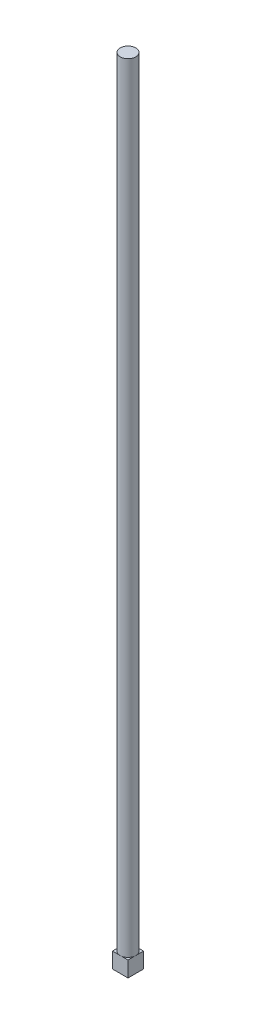
ISO-10303-21;
HEADER;
FILE_DESCRIPTION(('STEP AP214'),'2;1');
FILE_NAME('part.step','',(''),(''),'','','');
FILE_SCHEMA(('AUTOMOTIVE_DESIGN { 1 0 10303 214 1 1 1 1 }'));
ENDSEC;
DATA;
#1=APPLICATION_CONTEXT('core data for automotive mechanical design processes');
#2=APPLICATION_PROTOCOL_DEFINITION('international standard','automotive_design',2000,#1);
#3=PRODUCT_CONTEXT('',#1,'mechanical');
#4=PRODUCT('Part','Part','',(#3));
#5=PRODUCT_RELATED_PRODUCT_CATEGORY('part','',(#4));
#6=PRODUCT_DEFINITION_FORMATION('','',#4);
#7=PRODUCT_DEFINITION_CONTEXT('part definition',#1,'design');
#8=PRODUCT_DEFINITION('design','',#6,#7);
#9=PRODUCT_DEFINITION_SHAPE('','',#8);
#10=(LENGTH_UNIT() NAMED_UNIT(*) SI_UNIT(.MILLI.,.METRE.));
#11=(NAMED_UNIT(*) PLANE_ANGLE_UNIT() SI_UNIT($,.RADIAN.));
#12=(NAMED_UNIT(*) SI_UNIT($,.STERADIAN.) SOLID_ANGLE_UNIT());
#13=UNCERTAINTY_MEASURE_WITH_UNIT(LENGTH_MEASURE(1.E-05),#10,'distance_accuracy_value','');
#14=(GEOMETRIC_REPRESENTATION_CONTEXT(3) GLOBAL_UNCERTAINTY_ASSIGNED_CONTEXT((#13)) GLOBAL_UNIT_ASSIGNED_CONTEXT((#10,
#11,#12)) REPRESENTATION_CONTEXT('',''));
#15=CARTESIAN_POINT('',(0.,0.,0.));
#16=DIRECTION('',(0.,0.,1.));
#17=DIRECTION('',(1.,0.,0.));
#18=AXIS2_PLACEMENT_3D('',#15,#16,#17);
#19=CARTESIAN_POINT('',(0.,0.,0.));
#20=DIRECTION('',(0.,1.,0.));
#21=DIRECTION('',(0.,0.,1.));
#22=AXIS2_PLACEMENT_3D('',#19,#20,#21);
#23=PLANE('',#22);
#24=CARTESIAN_POINT('',(0.,0.,0.));
#25=DIRECTION('',(0.,1.,0.));
#26=DIRECTION('',(0.,0.,1.));
#27=AXIS2_PLACEMENT_3D('',#24,#25,#26);
#28=CIRCLE('',#27,12.7);
#29=CARTESIAN_POINT('',(0.,0.,12.7));
#30=VERTEX_POINT('',#29);
#31=CARTESIAN_POINT('',(12.7,0.,0.));
#32=VERTEX_POINT('',#31);
#33=EDGE_CURVE('E46',#30,#32,#28,.T.);
#34=ORIENTED_EDGE('',*,*,#33,.F.);
#35=DIRECTION('',(1.,0.,0.));
#36=VECTOR('',#35,1.);
#37=CARTESIAN_POINT('',(0.,0.,12.7));
#38=LINE('',#37,#36);
#39=CARTESIAN_POINT('',(12.7,0.,12.7));
#40=VERTEX_POINT('',#39);
#41=EDGE_CURVE('E100',#30,#40,#38,.T.);
#42=ORIENTED_EDGE('',*,*,#41,.T.);
#43=DIRECTION('',(0.,0.,1.));
#44=VECTOR('',#43,1.);
#45=CARTESIAN_POINT('',(12.7,0.,0.));
#46=LINE('',#45,#44);
#47=EDGE_CURVE('E99',#32,#40,#46,.T.);
#48=ORIENTED_EDGE('',*,*,#47,.F.);
#49=EDGE_LOOP('',(#34,#42,#48));
#50=FACE_BOUND('',#49,.T.);
#51=ADVANCED_FACE('F35',(#50),#23,.T.);
#52=CARTESIAN_POINT('',(0.,0.,-12.7));
#53=VERTEX_POINT('',#52);
#54=EDGE_CURVE('E11',#32,#53,#28,.T.);
#55=ORIENTED_EDGE('',*,*,#54,.F.);
#56=CARTESIAN_POINT('',(12.7,0.,-12.7));
#57=VERTEX_POINT('',#56);
#58=EDGE_CURVE('E132',#57,#32,#46,.T.);
#59=ORIENTED_EDGE('',*,*,#58,.F.);
#60=DIRECTION('',(1.,0.,0.));
#61=VECTOR('',#60,1.);
#62=CARTESIAN_POINT('',(0.,0.,-12.7));
#63=LINE('',#62,#61);
#64=EDGE_CURVE('E134',#53,#57,#63,.T.);
#65=ORIENTED_EDGE('',*,*,#64,.F.);
#66=EDGE_LOOP('',(#55,#59,#65));
#67=FACE_BOUND('',#66,.T.);
#68=ADVANCED_FACE('F149',(#67),#23,.T.);
#69=CARTESIAN_POINT('',(-12.7,0.,0.));
#70=VERTEX_POINT('',#69);
#71=EDGE_CURVE('E44',#53,#70,#28,.T.);
#72=ORIENTED_EDGE('',*,*,#71,.F.);
#73=CARTESIAN_POINT('',(-12.7,0.,-12.7));
#74=VERTEX_POINT('',#73);
#75=EDGE_CURVE('E125',#74,#53,#63,.T.);
#76=ORIENTED_EDGE('',*,*,#75,.F.);
#77=DIRECTION('',(0.,0.,1.));
#78=VECTOR('',#77,1.);
#79=CARTESIAN_POINT('',(-12.7,0.,0.));
#80=LINE('',#79,#78);
#81=EDGE_CURVE('E110',#74,#70,#80,.T.);
#82=ORIENTED_EDGE('',*,*,#81,.T.);
#83=EDGE_LOOP('',(#72,#76,#82));
#84=FACE_BOUND('',#83,.T.);
#85=ADVANCED_FACE('F152',(#84),#23,.T.);
#86=CARTESIAN_POINT('',(-12.7,-25.4,0.));
#87=DIRECTION('',(-1.,0.,0.));
#88=DIRECTION('',(0.,0.,1.));
#89=AXIS2_PLACEMENT_3D('',#86,#87,#88);
#90=PLANE('',#89);
#91=ORIENTED_EDGE('',*,*,#81,.F.);
#92=DIRECTION('',(0.,1.,0.));
#93=VECTOR('',#92,1.);
#94=CARTESIAN_POINT('',(-12.7,-25.4,-12.7));
#95=LINE('',#94,#93);
#96=CARTESIAN_POINT('',(-12.7,-25.4,-12.7));
#97=VERTEX_POINT('',#96);
#98=EDGE_CURVE('E116',#97,#74,#95,.T.);
#99=ORIENTED_EDGE('',*,*,#98,.F.);
#100=DIRECTION('',(0.,0.,1.));
#101=VECTOR('',#100,1.);
#102=CARTESIAN_POINT('',(-12.7,-25.4,0.));
#103=LINE('',#102,#101);
#104=CARTESIAN_POINT('',(-12.7,-25.4,12.7));
#105=VERTEX_POINT('',#104);
#106=EDGE_CURVE('E121',#97,#105,#103,.T.);
#107=ORIENTED_EDGE('',*,*,#106,.T.);
#108=DIRECTION('',(0.,1.,0.));
#109=VECTOR('',#108,1.);
#110=CARTESIAN_POINT('',(-12.7,-25.4,12.7));
#111=LINE('',#110,#109);
#112=CARTESIAN_POINT('',(-12.7,0.,12.7));
#113=VERTEX_POINT('',#112);
#114=EDGE_CURVE('E39',#105,#113,#111,.T.);
#115=ORIENTED_EDGE('',*,*,#114,.T.);
#116=EDGE_CURVE('E96',#70,#113,#80,.T.);
#117=ORIENTED_EDGE('',*,*,#116,.F.);
#118=EDGE_LOOP('',(#91,#99,#107,#115,#117));
#119=FACE_BOUND('',#118,.T.);
#120=ADVANCED_FACE('F37',(#119),#90,.T.);
#121=CARTESIAN_POINT('',(0.,-25.4,-12.7));
#122=DIRECTION('',(0.,0.,1.));
#123=DIRECTION('',(1.,0.,0.));
#124=AXIS2_PLACEMENT_3D('',#121,#122,#123);
#125=PLANE('',#124);
#126=ORIENTED_EDGE('',*,*,#75,.T.);
#127=ORIENTED_EDGE('',*,*,#64,.T.);
#128=DIRECTION('',(0.,1.,0.));
#129=VECTOR('',#128,1.);
#130=CARTESIAN_POINT('',(12.7,-25.4,-12.7));
#131=LINE('',#130,#129);
#132=CARTESIAN_POINT('',(12.7,-25.4,-12.7));
#133=VERTEX_POINT('',#132);
#134=EDGE_CURVE('E117',#133,#57,#131,.T.);
#135=ORIENTED_EDGE('',*,*,#134,.F.);
#136=DIRECTION('',(1.,0.,0.));
#137=VECTOR('',#136,1.);
#138=CARTESIAN_POINT('',(0.,-25.4,-12.7));
#139=LINE('',#138,#137);
#140=EDGE_CURVE('E129',#97,#133,#139,.T.);
#141=ORIENTED_EDGE('',*,*,#140,.F.);
#142=ORIENTED_EDGE('',*,*,#98,.T.);
#143=EDGE_LOOP('',(#126,#127,#135,#141,#142));
#144=FACE_BOUND('',#143,.T.);
#145=ADVANCED_FACE('F151',(#144),#125,.F.);
#146=CARTESIAN_POINT('',(12.7,-25.4,0.));
#147=DIRECTION('',(-1.,0.,0.));
#148=DIRECTION('',(0.,0.,1.));
#149=AXIS2_PLACEMENT_3D('',#146,#147,#148);
#150=PLANE('',#149);
#151=ORIENTED_EDGE('',*,*,#58,.T.);
#152=ORIENTED_EDGE('',*,*,#47,.T.);
#153=DIRECTION('',(0.,1.,0.));
#154=VECTOR('',#153,1.);
#155=CARTESIAN_POINT('',(12.7,-25.4,12.7));
#156=LINE('',#155,#154);
#157=CARTESIAN_POINT('',(12.7,-25.4,12.7));
#158=VERTEX_POINT('',#157);
#159=EDGE_CURVE('E108',#158,#40,#156,.T.);
#160=ORIENTED_EDGE('',*,*,#159,.F.);
#161=DIRECTION('',(0.,0.,1.));
#162=VECTOR('',#161,1.);
#163=CARTESIAN_POINT('',(12.7,-25.4,0.));
#164=LINE('',#163,#162);
#165=EDGE_CURVE('E127',#133,#158,#164,.T.);
#166=ORIENTED_EDGE('',*,*,#165,.F.);
#167=ORIENTED_EDGE('',*,*,#134,.T.);
#168=EDGE_LOOP('',(#151,#152,#160,#166,#167));
#169=FACE_BOUND('',#168,.T.);
#170=ADVANCED_FACE('F148',(#169),#150,.F.);
#171=CARTESIAN_POINT('',(0.,-25.4,12.7));
#172=DIRECTION('',(0.,0.,1.));
#173=DIRECTION('',(1.,0.,0.));
#174=AXIS2_PLACEMENT_3D('',#171,#172,#173);
#175=PLANE('',#174);
#176=EDGE_CURVE('E90',#113,#30,#38,.T.);
#177=ORIENTED_EDGE('',*,*,#176,.F.);
#178=ORIENTED_EDGE('',*,*,#114,.F.);
#179=DIRECTION('',(1.,0.,0.));
#180=VECTOR('',#179,1.);
#181=CARTESIAN_POINT('',(0.,-25.4,12.7));
#182=LINE('',#181,#180);
#183=EDGE_CURVE('E124',#105,#158,#182,.T.);
#184=ORIENTED_EDGE('',*,*,#183,.T.);
#185=ORIENTED_EDGE('',*,*,#159,.T.);
#186=ORIENTED_EDGE('',*,*,#41,.F.);
#187=EDGE_LOOP('',(#177,#178,#184,#185,#186));
#188=FACE_BOUND('',#187,.T.);
#189=ADVANCED_FACE('F105',(#188),#175,.T.);
#190=CARTESIAN_POINT('',(0.,-25.4,0.));
#191=DIRECTION('',(0.,1.,0.));
#192=DIRECTION('',(0.,0.,1.));
#193=AXIS2_PLACEMENT_3D('',#190,#191,#192);
#194=PLANE('',#193);
#195=ORIENTED_EDGE('',*,*,#106,.F.);
#196=ORIENTED_EDGE('',*,*,#140,.T.);
#197=ORIENTED_EDGE('',*,*,#165,.T.);
#198=ORIENTED_EDGE('',*,*,#183,.F.);
#199=EDGE_LOOP('',(#195,#196,#197,#198));
#200=FACE_BOUND('',#199,.T.);
#201=ADVANCED_FACE('F143',(#200),#194,.F.);
#202=EDGE_CURVE('E94',#70,#30,#28,.T.);
#203=ORIENTED_EDGE('',*,*,#202,.F.);
#204=ORIENTED_EDGE('',*,*,#116,.T.);
#205=ORIENTED_EDGE('',*,*,#176,.T.);
#206=EDGE_LOOP('',(#203,#204,#205));
#207=FACE_BOUND('',#206,.T.);
#208=ADVANCED_FACE('F92',(#207),#23,.T.);
#209=CARTESIAN_POINT('',(0.,1270.,0.));
#210=DIRECTION('',(0.,-1.,0.));
#211=DIRECTION('',(0.,0.,-1.));
#212=AXIS2_PLACEMENT_3D('',#209,#210,#211);
#213=CYLINDRICAL_SURFACE('',#212,12.7);
#214=CARTESIAN_POINT('',(0.,1270.,0.));
#215=DIRECTION('',(0.,1.,0.));
#216=DIRECTION('',(0.,0.,1.));
#217=AXIS2_PLACEMENT_3D('',#214,#215,#216);
#218=CIRCLE('',#217,12.7);
#219=CARTESIAN_POINT('',(0.,1270.,12.7));
#220=VERTEX_POINT('',#219);
#221=EDGE_CURVE('E114',#220,#220,#218,.T.);
#222=ORIENTED_EDGE('',*,*,#221,.F.);
#223=EDGE_LOOP('',(#222));
#224=FACE_BOUND('',#223,.T.);
#225=ORIENTED_EDGE('',*,*,#33,.T.);
#226=ORIENTED_EDGE('',*,*,#54,.T.);
#227=ORIENTED_EDGE('',*,*,#71,.T.);
#228=ORIENTED_EDGE('',*,*,#202,.T.);
#229=EDGE_LOOP('',(#225,#226,#227,#228));
#230=FACE_BOUND('',#229,.T.);
#231=ADVANCED_FACE('F115',(#224,#230),#213,.T.);
#232=CARTESIAN_POINT('',(0.,1270.,0.));
#233=DIRECTION('',(0.,1.,0.));
#234=DIRECTION('',(0.,0.,1.));
#235=AXIS2_PLACEMENT_3D('',#232,#233,#234);
#236=PLANE('',#235);
#237=ORIENTED_EDGE('',*,*,#221,.T.);
#238=EDGE_LOOP('',(#237));
#239=FACE_BOUND('',#238,.T.);
#240=ADVANCED_FACE('F225',(#239),#236,.T.);
#241=CLOSED_SHELL('',(#51,#68,#85,#120,#145,#170,#189,#201,#208,#231,#240));
#242=MANIFOLD_SOLID_BREP('B2',#241);
#243=ADVANCED_BREP_SHAPE_REPRESENTATION('',(#18,#242),#14);
#244=SHAPE_DEFINITION_REPRESENTATION(#9,#243);
ENDSEC;
END-ISO-10303-21;
